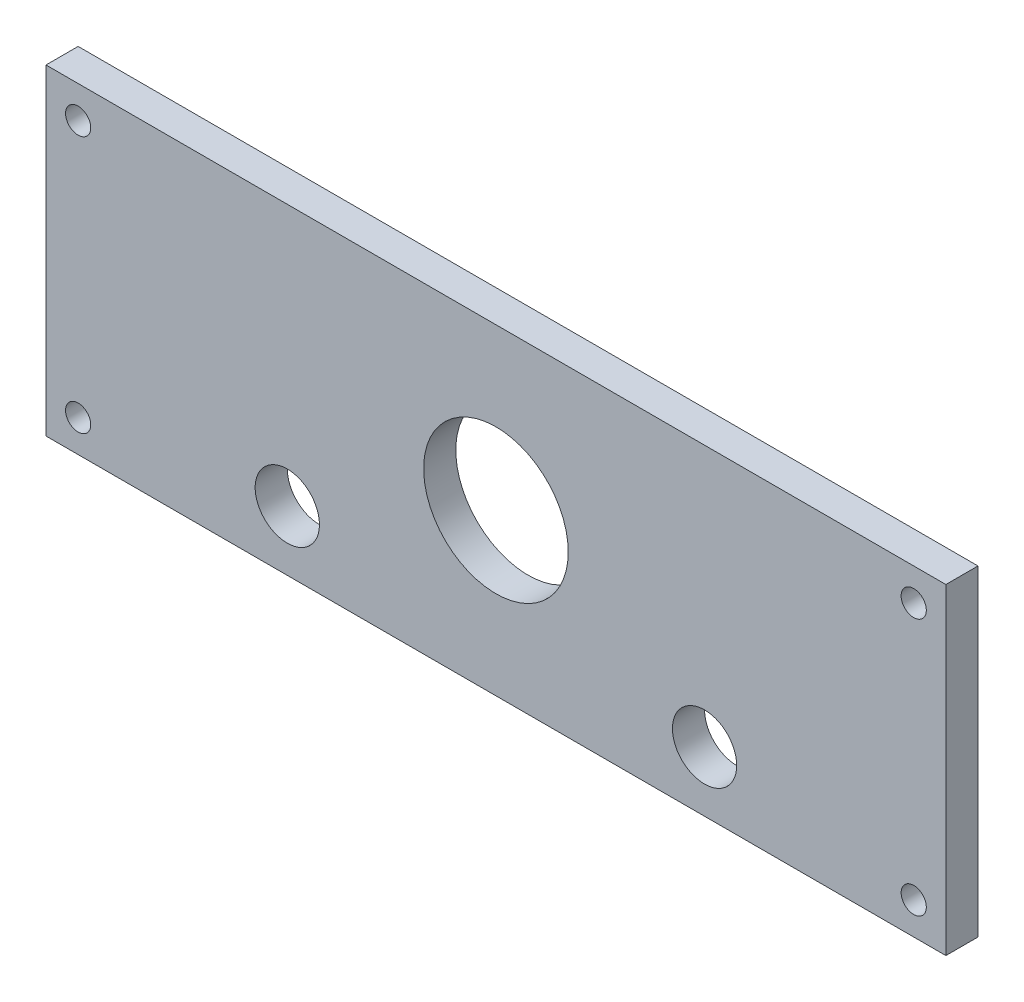
ISO-10303-21;
HEADER;
FILE_DESCRIPTION(('STEP AP214'),'2;1');
FILE_NAME('part.step','',(''),(''),'','','');
FILE_SCHEMA(('AUTOMOTIVE_DESIGN { 1 0 10303 214 1 1 1 1 }'));
ENDSEC;
DATA;
#1=APPLICATION_CONTEXT('core data for automotive mechanical design processes');
#2=APPLICATION_PROTOCOL_DEFINITION('international standard','automotive_design',2000,#1);
#3=PRODUCT_CONTEXT('',#1,'mechanical');
#4=PRODUCT('Part','Part','',(#3));
#5=PRODUCT_RELATED_PRODUCT_CATEGORY('part','',(#4));
#6=PRODUCT_DEFINITION_FORMATION('','',#4);
#7=PRODUCT_DEFINITION_CONTEXT('part definition',#1,'design');
#8=PRODUCT_DEFINITION('design','',#6,#7);
#9=PRODUCT_DEFINITION_SHAPE('','',#8);
#10=(LENGTH_UNIT() NAMED_UNIT(*) SI_UNIT(.MILLI.,.METRE.));
#11=(NAMED_UNIT(*) PLANE_ANGLE_UNIT() SI_UNIT($,.RADIAN.));
#12=(NAMED_UNIT(*) SI_UNIT($,.STERADIAN.) SOLID_ANGLE_UNIT());
#13=UNCERTAINTY_MEASURE_WITH_UNIT(LENGTH_MEASURE(1.E-05),#10,'distance_accuracy_value','');
#14=(GEOMETRIC_REPRESENTATION_CONTEXT(3) GLOBAL_UNCERTAINTY_ASSIGNED_CONTEXT((#13)) GLOBAL_UNIT_ASSIGNED_CONTEXT((#10,
#11,#12)) REPRESENTATION_CONTEXT('',''));
#15=CARTESIAN_POINT('',(0.,0.,0.));
#16=DIRECTION('',(0.,0.,1.));
#17=DIRECTION('',(1.,0.,0.));
#18=AXIS2_PLACEMENT_3D('',#15,#16,#17);
#19=CARTESIAN_POINT('',(0.,17.8308,6.35));
#20=DIRECTION('',(0.,1.,0.));
#21=DIRECTION('',(0.,0.,1.));
#22=AXIS2_PLACEMENT_3D('',#19,#20,#21);
#23=PLANE('',#22);
#24=DIRECTION('',(1.,0.,0.));
#25=VECTOR('',#24,1.);
#26=CARTESIAN_POINT('',(0.,17.8308,0.));
#27=LINE('',#26,#25);
#28=CARTESIAN_POINT('',(-88.9,17.8308,0.));
#29=VERTEX_POINT('',#28);
#30=CARTESIAN_POINT('',(88.9,17.8308,0.));
#31=VERTEX_POINT('',#30);
#32=EDGE_CURVE('E109',#29,#31,#27,.T.);
#33=ORIENTED_EDGE('',*,*,#32,.T.);
#34=DIRECTION('',(0.,0.,-1.));
#35=VECTOR('',#34,1.);
#36=CARTESIAN_POINT('',(88.9,17.8308,6.35));
#37=LINE('',#36,#35);
#38=CARTESIAN_POINT('',(88.9,17.8308,6.35));
#39=VERTEX_POINT('',#38);
#40=EDGE_CURVE('E11',#39,#31,#37,.T.);
#41=ORIENTED_EDGE('',*,*,#40,.F.);
#42=DIRECTION('',(1.,0.,0.));
#43=VECTOR('',#42,1.);
#44=CARTESIAN_POINT('',(0.,17.8308,6.35));
#45=LINE('',#44,#43);
#46=CARTESIAN_POINT('',(-88.9,17.8308,6.35));
#47=VERTEX_POINT('',#46);
#48=EDGE_CURVE('E86',#47,#39,#45,.T.);
#49=ORIENTED_EDGE('',*,*,#48,.F.);
#50=DIRECTION('',(0.,0.,-1.));
#51=VECTOR('',#50,1.);
#52=CARTESIAN_POINT('',(-88.9,17.8308,6.35));
#53=LINE('',#52,#51);
#54=EDGE_CURVE('E52',#47,#29,#53,.T.);
#55=ORIENTED_EDGE('',*,*,#54,.T.);
#56=EDGE_LOOP('',(#33,#41,#49,#55));
#57=FACE_BOUND('',#56,.T.);
#58=ADVANCED_FACE('F36',(#57),#23,.F.);
#59=CARTESIAN_POINT('',(88.9,0.,6.35));
#60=DIRECTION('',(-1.,0.,0.));
#61=DIRECTION('',(0.,0.,1.));
#62=AXIS2_PLACEMENT_3D('',#59,#60,#61);
#63=PLANE('',#62);
#64=DIRECTION('',(0.,1.,0.));
#65=VECTOR('',#64,1.);
#66=CARTESIAN_POINT('',(88.9,0.,0.));
#67=LINE('',#66,#65);
#68=CARTESIAN_POINT('',(88.9,81.3308,0.));
#69=VERTEX_POINT('',#68);
#70=EDGE_CURVE('E91',#31,#69,#67,.T.);
#71=ORIENTED_EDGE('',*,*,#70,.T.);
#72=DIRECTION('',(0.,0.,-1.));
#73=VECTOR('',#72,1.);
#74=CARTESIAN_POINT('',(88.9,81.3308,6.35));
#75=LINE('',#74,#73);
#76=CARTESIAN_POINT('',(88.9,81.3308,6.35));
#77=VERTEX_POINT('',#76);
#78=EDGE_CURVE('E44',#77,#69,#75,.T.);
#79=ORIENTED_EDGE('',*,*,#78,.F.);
#80=DIRECTION('',(0.,1.,0.));
#81=VECTOR('',#80,1.);
#82=CARTESIAN_POINT('',(88.9,0.,6.35));
#83=LINE('',#82,#81);
#84=EDGE_CURVE('E77',#39,#77,#83,.T.);
#85=ORIENTED_EDGE('',*,*,#84,.F.);
#86=ORIENTED_EDGE('',*,*,#40,.T.);
#87=EDGE_LOOP('',(#71,#79,#85,#86));
#88=FACE_BOUND('',#87,.T.);
#89=ADVANCED_FACE('F90',(#88),#63,.F.);
#90=CARTESIAN_POINT('',(0.,81.3308,6.35));
#91=DIRECTION('',(0.,1.,0.));
#92=DIRECTION('',(0.,0.,1.));
#93=AXIS2_PLACEMENT_3D('',#90,#91,#92);
#94=PLANE('',#93);
#95=DIRECTION('',(1.,0.,0.));
#96=VECTOR('',#95,1.);
#97=CARTESIAN_POINT('',(0.,81.3308,0.));
#98=LINE('',#97,#96);
#99=CARTESIAN_POINT('',(-88.9,81.3308,0.));
#100=VERTEX_POINT('',#99);
#101=EDGE_CURVE('E113',#100,#69,#98,.T.);
#102=ORIENTED_EDGE('',*,*,#101,.F.);
#103=DIRECTION('',(0.,0.,-1.));
#104=VECTOR('',#103,1.);
#105=CARTESIAN_POINT('',(-88.9,81.3308,6.35));
#106=LINE('',#105,#104);
#107=CARTESIAN_POINT('',(-88.9,81.3308,6.35));
#108=VERTEX_POINT('',#107);
#109=EDGE_CURVE('E66',#108,#100,#106,.T.);
#110=ORIENTED_EDGE('',*,*,#109,.F.);
#111=DIRECTION('',(1.,0.,0.));
#112=VECTOR('',#111,1.);
#113=CARTESIAN_POINT('',(0.,81.3308,6.35));
#114=LINE('',#113,#112);
#115=EDGE_CURVE('E85',#108,#77,#114,.T.);
#116=ORIENTED_EDGE('',*,*,#115,.T.);
#117=ORIENTED_EDGE('',*,*,#78,.T.);
#118=EDGE_LOOP('',(#102,#110,#116,#117));
#119=FACE_BOUND('',#118,.T.);
#120=ADVANCED_FACE('F94',(#119),#94,.T.);
#121=CARTESIAN_POINT('',(0.,49.5808,6.35));
#122=DIRECTION('',(0.,0.,-1.));
#123=DIRECTION('',(-1.,0.,0.));
#124=AXIS2_PLACEMENT_3D('',#121,#122,#123);
#125=CYLINDRICAL_SURFACE('',#124,14.2875);
#126=CARTESIAN_POINT('',(0.,49.5808,6.35));
#127=DIRECTION('',(0.,0.,1.));
#128=DIRECTION('',(1.,0.,0.));
#129=AXIS2_PLACEMENT_3D('',#126,#127,#128);
#130=CIRCLE('',#129,14.2875);
#131=CARTESIAN_POINT('',(14.2875,49.5808,6.35));
#132=VERTEX_POINT('',#131);
#133=EDGE_CURVE('E103',#132,#132,#130,.T.);
#134=ORIENTED_EDGE('',*,*,#133,.T.);
#135=EDGE_LOOP('',(#134));
#136=FACE_BOUND('',#135,.T.);
#137=CARTESIAN_POINT('',(0.,49.5808,0.));
#138=DIRECTION('',(0.,0.,1.));
#139=DIRECTION('',(1.,0.,0.));
#140=AXIS2_PLACEMENT_3D('',#137,#138,#139);
#141=CIRCLE('',#140,14.2875);
#142=CARTESIAN_POINT('',(14.2875,49.5808,0.));
#143=VERTEX_POINT('',#142);
#144=EDGE_CURVE('E121',#143,#143,#141,.T.);
#145=ORIENTED_EDGE('',*,*,#144,.F.);
#146=EDGE_LOOP('',(#145));
#147=FACE_BOUND('',#146,.T.);
#148=ADVANCED_FACE('F174',(#136,#147),#125,.F.);
#149=CARTESIAN_POINT('',(-41.2219683088319,29.6882018442623,6.35));
#150=DIRECTION('',(0.,0.,-1.));
#151=DIRECTION('',(-1.,0.,0.));
#152=AXIS2_PLACEMENT_3D('',#149,#150,#151);
#153=CYLINDRICAL_SURFACE('',#152,6.35);
#154=CARTESIAN_POINT('',(-41.2219683088319,29.6882018442623,6.35));
#155=DIRECTION('',(0.,0.,1.));
#156=DIRECTION('',(1.,0.,0.));
#157=AXIS2_PLACEMENT_3D('',#154,#155,#156);
#158=CIRCLE('',#157,6.35);
#159=CARTESIAN_POINT('',(-34.8719683088319,29.6882018442623,6.35));
#160=VERTEX_POINT('',#159);
#161=EDGE_CURVE('E97',#160,#160,#158,.T.);
#162=ORIENTED_EDGE('',*,*,#161,.T.);
#163=EDGE_LOOP('',(#162));
#164=FACE_BOUND('',#163,.T.);
#165=CARTESIAN_POINT('',(-41.2219683088319,29.6882018442623,0.));
#166=DIRECTION('',(0.,0.,1.));
#167=DIRECTION('',(1.,0.,0.));
#168=AXIS2_PLACEMENT_3D('',#165,#166,#167);
#169=CIRCLE('',#168,6.35);
#170=CARTESIAN_POINT('',(-34.8719683088319,29.6882018442623,0.));
#171=VERTEX_POINT('',#170);
#172=EDGE_CURVE('E118',#171,#171,#169,.T.);
#173=ORIENTED_EDGE('',*,*,#172,.F.);
#174=EDGE_LOOP('',(#173));
#175=FACE_BOUND('',#174,.T.);
#176=ADVANCED_FACE('F176',(#164,#175),#153,.F.);
#177=CARTESIAN_POINT('',(-88.9,0.,6.35));
#178=DIRECTION('',(-1.,0.,0.));
#179=DIRECTION('',(0.,0.,1.));
#180=AXIS2_PLACEMENT_3D('',#177,#178,#179);
#181=PLANE('',#180);
#182=DIRECTION('',(0.,1.,0.));
#183=VECTOR('',#182,1.);
#184=CARTESIAN_POINT('',(-88.9,0.,0.));
#185=LINE('',#184,#183);
#186=EDGE_CURVE('E115',#29,#100,#185,.T.);
#187=ORIENTED_EDGE('',*,*,#186,.F.);
#188=ORIENTED_EDGE('',*,*,#54,.F.);
#189=DIRECTION('',(0.,1.,0.));
#190=VECTOR('',#189,1.);
#191=CARTESIAN_POINT('',(-88.9,0.,6.35));
#192=LINE('',#191,#190);
#193=EDGE_CURVE('E95',#47,#108,#192,.T.);
#194=ORIENTED_EDGE('',*,*,#193,.T.);
#195=ORIENTED_EDGE('',*,*,#109,.T.);
#196=EDGE_LOOP('',(#187,#188,#194,#195));
#197=FACE_BOUND('',#196,.T.);
#198=ADVANCED_FACE('F183',(#197),#181,.T.);
#199=CARTESIAN_POINT('',(41.2219683088319,29.6882018442623,6.35));
#200=DIRECTION('',(0.,0.,-1.));
#201=DIRECTION('',(-1.,0.,0.));
#202=AXIS2_PLACEMENT_3D('',#199,#200,#201);
#203=CYLINDRICAL_SURFACE('',#202,6.35);
#204=CARTESIAN_POINT('',(41.2219683088319,29.6882018442623,6.35));
#205=DIRECTION('',(0.,0.,1.));
#206=DIRECTION('',(1.,0.,0.));
#207=AXIS2_PLACEMENT_3D('',#204,#205,#206);
#208=CIRCLE('',#207,6.35);
#209=CARTESIAN_POINT('',(47.5719683088319,29.6882018442623,6.35));
#210=VERTEX_POINT('',#209);
#211=EDGE_CURVE('E106',#210,#210,#208,.F.);
#212=ORIENTED_EDGE('',*,*,#211,.F.);
#213=EDGE_LOOP('',(#212));
#214=FACE_BOUND('',#213,.T.);
#215=CARTESIAN_POINT('',(41.2219683088319,29.6882018442623,0.));
#216=DIRECTION('',(0.,0.,1.));
#217=DIRECTION('',(1.,0.,0.));
#218=AXIS2_PLACEMENT_3D('',#215,#216,#217);
#219=CIRCLE('',#218,6.35);
#220=CARTESIAN_POINT('',(47.5719683088319,29.6882018442623,0.));
#221=VERTEX_POINT('',#220);
#222=EDGE_CURVE('E124',#221,#221,#219,.F.);
#223=ORIENTED_EDGE('',*,*,#222,.T.);
#224=EDGE_LOOP('',(#223));
#225=FACE_BOUND('',#224,.T.);
#226=ADVANCED_FACE('F193',(#214,#225),#203,.F.);
#227=CARTESIAN_POINT('',(0.,0.,6.35));
#228=DIRECTION('',(0.,0.,1.));
#229=DIRECTION('',(1.,0.,0.));
#230=AXIS2_PLACEMENT_3D('',#227,#228,#229);
#231=PLANE('',#230);
#232=CARTESIAN_POINT('',(82.55,74.9808,6.35));
#233=DIRECTION('',(0.,0.,-1.));
#234=DIRECTION('',(-1.,0.,0.));
#235=AXIS2_PLACEMENT_3D('',#232,#233,#234);
#236=CIRCLE('',#235,2.4892);
#237=CARTESIAN_POINT('',(80.0608,74.9808,6.35));
#238=VERTEX_POINT('',#237);
#239=EDGE_CURVE('E148',#238,#238,#236,.T.);
#240=ORIENTED_EDGE('',*,*,#239,.T.);
#241=EDGE_LOOP('',(#240));
#242=FACE_BOUND('',#241,.T.);
#243=CARTESIAN_POINT('',(82.55,24.1808,6.35));
#244=DIRECTION('',(0.,0.,-1.));
#245=DIRECTION('',(-1.,0.,0.));
#246=AXIS2_PLACEMENT_3D('',#243,#244,#245);
#247=CIRCLE('',#246,2.4892);
#248=CARTESIAN_POINT('',(80.0608,24.1808,6.35));
#249=VERTEX_POINT('',#248);
#250=EDGE_CURVE('E142',#249,#249,#247,.T.);
#251=ORIENTED_EDGE('',*,*,#250,.T.);
#252=EDGE_LOOP('',(#251));
#253=FACE_BOUND('',#252,.T.);
#254=CARTESIAN_POINT('',(-82.55,24.1808,6.35));
#255=DIRECTION('',(0.,0.,-1.));
#256=DIRECTION('',(-1.,0.,0.));
#257=AXIS2_PLACEMENT_3D('',#254,#255,#256);
#258=CIRCLE('',#257,2.4892);
#259=CARTESIAN_POINT('',(-85.0392,24.1808,6.35));
#260=VERTEX_POINT('',#259);
#261=EDGE_CURVE('E136',#260,#260,#258,.T.);
#262=ORIENTED_EDGE('',*,*,#261,.T.);
#263=EDGE_LOOP('',(#262));
#264=FACE_BOUND('',#263,.T.);
#265=CARTESIAN_POINT('',(-82.55,74.9808,6.35));
#266=DIRECTION('',(0.,0.,-1.));
#267=DIRECTION('',(-1.,0.,0.));
#268=AXIS2_PLACEMENT_3D('',#265,#266,#267);
#269=CIRCLE('',#268,2.4892);
#270=CARTESIAN_POINT('',(-85.0392,74.9808,6.35));
#271=VERTEX_POINT('',#270);
#272=EDGE_CURVE('E111',#271,#271,#269,.T.);
#273=ORIENTED_EDGE('',*,*,#272,.T.);
#274=EDGE_LOOP('',(#273));
#275=FACE_BOUND('',#274,.T.);
#276=ORIENTED_EDGE('',*,*,#48,.T.);
#277=ORIENTED_EDGE('',*,*,#84,.T.);
#278=ORIENTED_EDGE('',*,*,#115,.F.);
#279=ORIENTED_EDGE('',*,*,#193,.F.);
#280=EDGE_LOOP('',(#276,#277,#278,#279));
#281=FACE_BOUND('',#280,.T.);
#282=ORIENTED_EDGE('',*,*,#161,.F.);
#283=EDGE_LOOP('',(#282));
#284=FACE_BOUND('',#283,.T.);
#285=ORIENTED_EDGE('',*,*,#133,.F.);
#286=EDGE_LOOP('',(#285));
#287=FACE_BOUND('',#286,.T.);
#288=ORIENTED_EDGE('',*,*,#211,.T.);
#289=EDGE_LOOP('',(#288));
#290=FACE_BOUND('',#289,.T.);
#291=ADVANCED_FACE('F81',(#242,#253,#264,#275,#281,#284,#287,#290),#231,.T.);
#292=CARTESIAN_POINT('',(0.,0.,0.));
#293=DIRECTION('',(0.,0.,1.));
#294=DIRECTION('',(1.,0.,0.));
#295=AXIS2_PLACEMENT_3D('',#292,#293,#294);
#296=PLANE('',#295);
#297=CARTESIAN_POINT('',(82.55,74.9808,0.));
#298=DIRECTION('',(0.,0.,-1.));
#299=DIRECTION('',(-1.,0.,0.));
#300=AXIS2_PLACEMENT_3D('',#297,#298,#299);
#301=CIRCLE('',#300,2.48919999999998);
#302=CARTESIAN_POINT('',(80.0608,74.9808,0.));
#303=VERTEX_POINT('',#302);
#304=EDGE_CURVE('E151',#303,#303,#301,.T.);
#305=ORIENTED_EDGE('',*,*,#304,.F.);
#306=EDGE_LOOP('',(#305));
#307=FACE_BOUND('',#306,.T.);
#308=CARTESIAN_POINT('',(82.55,24.1808,0.));
#309=DIRECTION('',(0.,0.,-1.));
#310=DIRECTION('',(-1.,0.,0.));
#311=AXIS2_PLACEMENT_3D('',#308,#309,#310);
#312=CIRCLE('',#311,2.48919999999998);
#313=CARTESIAN_POINT('',(80.0608,24.1808,0.));
#314=VERTEX_POINT('',#313);
#315=EDGE_CURVE('E145',#314,#314,#312,.T.);
#316=ORIENTED_EDGE('',*,*,#315,.F.);
#317=EDGE_LOOP('',(#316));
#318=FACE_BOUND('',#317,.T.);
#319=CARTESIAN_POINT('',(-82.55,24.1808,0.));
#320=DIRECTION('',(0.,0.,-1.));
#321=DIRECTION('',(-1.,0.,0.));
#322=AXIS2_PLACEMENT_3D('',#319,#320,#321);
#323=CIRCLE('',#322,2.48919999999998);
#324=CARTESIAN_POINT('',(-85.0392,24.1808,0.));
#325=VERTEX_POINT('',#324);
#326=EDGE_CURVE('E139',#325,#325,#323,.T.);
#327=ORIENTED_EDGE('',*,*,#326,.F.);
#328=EDGE_LOOP('',(#327));
#329=FACE_BOUND('',#328,.T.);
#330=CARTESIAN_POINT('',(-82.55,74.9808,0.));
#331=DIRECTION('',(0.,0.,-1.));
#332=DIRECTION('',(-1.,0.,0.));
#333=AXIS2_PLACEMENT_3D('',#330,#331,#332);
#334=CIRCLE('',#333,2.48919999999998);
#335=CARTESIAN_POINT('',(-85.0392,74.9808,0.));
#336=VERTEX_POINT('',#335);
#337=EDGE_CURVE('E133',#336,#336,#334,.T.);
#338=ORIENTED_EDGE('',*,*,#337,.F.);
#339=EDGE_LOOP('',(#338));
#340=FACE_BOUND('',#339,.T.);
#341=ORIENTED_EDGE('',*,*,#32,.F.);
#342=ORIENTED_EDGE('',*,*,#186,.T.);
#343=ORIENTED_EDGE('',*,*,#101,.T.);
#344=ORIENTED_EDGE('',*,*,#70,.F.);
#345=EDGE_LOOP('',(#341,#342,#343,#344));
#346=FACE_BOUND('',#345,.T.);
#347=ORIENTED_EDGE('',*,*,#172,.T.);
#348=EDGE_LOOP('',(#347));
#349=FACE_BOUND('',#348,.T.);
#350=ORIENTED_EDGE('',*,*,#144,.T.);
#351=EDGE_LOOP('',(#350));
#352=FACE_BOUND('',#351,.T.);
#353=ORIENTED_EDGE('',*,*,#222,.F.);
#354=EDGE_LOOP('',(#353));
#355=FACE_BOUND('',#354,.T.);
#356=ADVANCED_FACE('F157',(#307,#318,#329,#340,#346,#349,#352,#355),#296,.F.);
#357=CARTESIAN_POINT('',(-82.55,74.9808,0.));
#358=DIRECTION('',(0.,0.,-1.));
#359=DIRECTION('',(-1.,0.,0.));
#360=AXIS2_PLACEMENT_3D('',#357,#358,#359);
#361=CYLINDRICAL_SURFACE('',#360,2.48919999999999);
#362=ORIENTED_EDGE('',*,*,#272,.F.);
#363=EDGE_LOOP('',(#362));
#364=FACE_BOUND('',#363,.T.);
#365=ORIENTED_EDGE('',*,*,#337,.T.);
#366=EDGE_LOOP('',(#365));
#367=FACE_BOUND('',#366,.T.);
#368=ADVANCED_FACE('F160',(#364,#367),#361,.F.);
#369=CARTESIAN_POINT('',(-82.55,24.1808,0.));
#370=DIRECTION('',(0.,0.,-1.));
#371=DIRECTION('',(-1.,0.,0.));
#372=AXIS2_PLACEMENT_3D('',#369,#370,#371);
#373=CYLINDRICAL_SURFACE('',#372,2.48919999999999);
#374=ORIENTED_EDGE('',*,*,#261,.F.);
#375=EDGE_LOOP('',(#374));
#376=FACE_BOUND('',#375,.T.);
#377=ORIENTED_EDGE('',*,*,#326,.T.);
#378=EDGE_LOOP('',(#377));
#379=FACE_BOUND('',#378,.T.);
#380=ADVANCED_FACE('F208',(#376,#379),#373,.F.);
#381=CARTESIAN_POINT('',(82.55,24.1808,0.));
#382=DIRECTION('',(0.,0.,-1.));
#383=DIRECTION('',(-1.,0.,0.));
#384=AXIS2_PLACEMENT_3D('',#381,#382,#383);
#385=CYLINDRICAL_SURFACE('',#384,2.48919999999999);
#386=ORIENTED_EDGE('',*,*,#250,.F.);
#387=EDGE_LOOP('',(#386));
#388=FACE_BOUND('',#387,.T.);
#389=ORIENTED_EDGE('',*,*,#315,.T.);
#390=EDGE_LOOP('',(#389));
#391=FACE_BOUND('',#390,.T.);
#392=ADVANCED_FACE('F212',(#388,#391),#385,.F.);
#393=CARTESIAN_POINT('',(82.55,74.9808,0.));
#394=DIRECTION('',(0.,0.,-1.));
#395=DIRECTION('',(-1.,0.,0.));
#396=AXIS2_PLACEMENT_3D('',#393,#394,#395);
#397=CYLINDRICAL_SURFACE('',#396,2.48919999999999);
#398=ORIENTED_EDGE('',*,*,#239,.F.);
#399=EDGE_LOOP('',(#398));
#400=FACE_BOUND('',#399,.T.);
#401=ORIENTED_EDGE('',*,*,#304,.T.);
#402=EDGE_LOOP('',(#401));
#403=FACE_BOUND('',#402,.T.);
#404=ADVANCED_FACE('F155',(#400,#403),#397,.F.);
#405=CLOSED_SHELL('',(#58,#89,#120,#148,#176,#198,#226,#291,#356,#368,#380,#392,#404));
#406=MANIFOLD_SOLID_BREP('B2',#405);
#407=ADVANCED_BREP_SHAPE_REPRESENTATION('',(#18,#406),#14);
#408=SHAPE_DEFINITION_REPRESENTATION(#9,#407);
ENDSEC;
END-ISO-10303-21;
